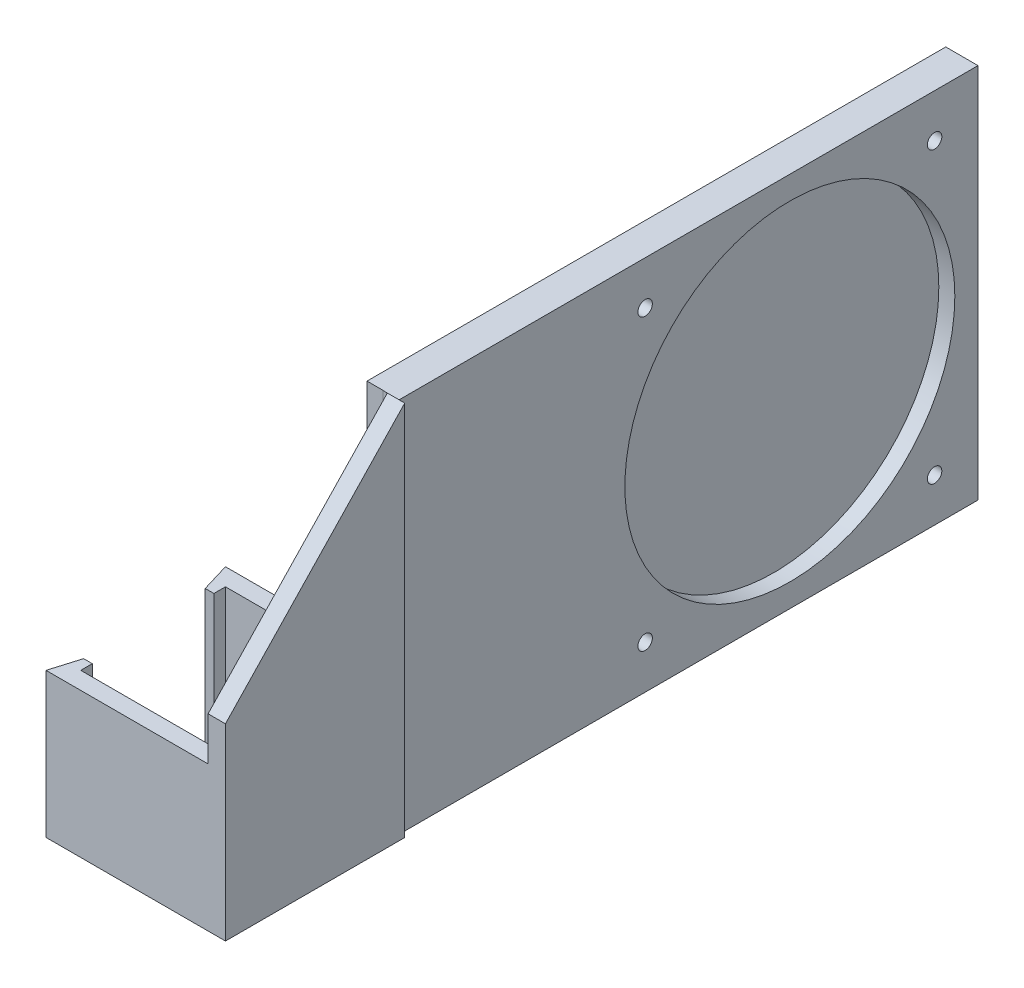
ISO-10303-21;
HEADER;
FILE_DESCRIPTION(('STEP AP214'),'2;1');
FILE_NAME('part.step','',(''),(''),'','','');
FILE_SCHEMA(('AUTOMOTIVE_DESIGN { 1 0 10303 214 1 1 1 1 }'));
ENDSEC;
DATA;
#1=APPLICATION_CONTEXT('core data for automotive mechanical design processes');
#2=APPLICATION_PROTOCOL_DEFINITION('international standard','automotive_design',2000,#1);
#3=PRODUCT_CONTEXT('',#1,'mechanical');
#4=PRODUCT('Part','Part','',(#3));
#5=PRODUCT_RELATED_PRODUCT_CATEGORY('part','',(#4));
#6=PRODUCT_DEFINITION_FORMATION('','',#4);
#7=PRODUCT_DEFINITION_CONTEXT('part definition',#1,'design');
#8=PRODUCT_DEFINITION('design','',#6,#7);
#9=PRODUCT_DEFINITION_SHAPE('','',#8);
#10=(LENGTH_UNIT() NAMED_UNIT(*) SI_UNIT(.MILLI.,.METRE.));
#11=(NAMED_UNIT(*) PLANE_ANGLE_UNIT() SI_UNIT($,.RADIAN.));
#12=(NAMED_UNIT(*) SI_UNIT($,.STERADIAN.) SOLID_ANGLE_UNIT());
#13=UNCERTAINTY_MEASURE_WITH_UNIT(LENGTH_MEASURE(1.E-05),#10,'distance_accuracy_value','');
#14=(GEOMETRIC_REPRESENTATION_CONTEXT(3) GLOBAL_UNCERTAINTY_ASSIGNED_CONTEXT((#13)) GLOBAL_UNIT_ASSIGNED_CONTEXT((#10,
#11,#12)) REPRESENTATION_CONTEXT('',''));
#15=CARTESIAN_POINT('',(0.,0.,0.));
#16=DIRECTION('',(0.,0.,1.));
#17=DIRECTION('',(1.,0.,0.));
#18=AXIS2_PLACEMENT_3D('',#15,#16,#17);
#19=CARTESIAN_POINT('',(0.,25.,0.));
#20=DIRECTION('',(0.,1.,0.));
#21=DIRECTION('',(0.,0.,1.));
#22=AXIS2_PLACEMENT_3D('',#19,#20,#21);
#23=PLANE('',#22);
#24=DIRECTION('',(1.,0.,0.));
#25=VECTOR('',#24,1.);
#26=CARTESIAN_POINT('',(-66.8257575757576,25.,-3.96973979401218));
#27=LINE('',#26,#25);
#28=CARTESIAN_POINT('',(-66.8257575757576,25.,-3.96973979401218));
#29=VERTEX_POINT('',#28);
#30=CARTESIAN_POINT('',(-38.8257575757576,25.,-3.96973979401218));
#31=VERTEX_POINT('',#30);
#32=EDGE_CURVE('E404',#29,#31,#27,.T.);
#33=ORIENTED_EDGE('',*,*,#32,.T.);
#34=DIRECTION('',(0.,0.,1.));
#35=VECTOR('',#34,1.);
#36=CARTESIAN_POINT('',(-38.8257575757576,25.,-34.9382664031757));
#37=LINE('',#36,#35);
#38=CARTESIAN_POINT('',(-38.8257575757576,25.,-6.96973979401218));
#39=VERTEX_POINT('',#38);
#40=EDGE_CURVE('E328',#39,#31,#37,.T.);
#41=ORIENTED_EDGE('',*,*,#40,.F.);
#42=DIRECTION('',(-1.,0.,0.));
#43=VECTOR('',#42,1.);
#44=CARTESIAN_POINT('',(-38.8257575757576,25.,-6.96973979401218));
#45=LINE('',#44,#43);
#46=CARTESIAN_POINT('',(-63.8257575757576,25.,-6.96973979401218));
#47=VERTEX_POINT('',#46);
#48=EDGE_CURVE('E398',#39,#47,#45,.T.);
#49=ORIENTED_EDGE('',*,*,#48,.T.);
#50=DIRECTION('',(0.,0.,-1.));
#51=VECTOR('',#50,1.);
#52=CARTESIAN_POINT('',(-63.8257575757576,25.,-6.96973979401218));
#53=LINE('',#52,#51);
#54=CARTESIAN_POINT('',(-63.8257575757576,25.,-8.96973979401218));
#55=VERTEX_POINT('',#54);
#56=EDGE_CURVE('E400',#47,#55,#53,.T.);
#57=ORIENTED_EDGE('',*,*,#56,.T.);
#58=DIRECTION('',(-1.,0.,0.));
#59=VECTOR('',#58,1.);
#60=CARTESIAN_POINT('',(-63.8257575757576,25.,-8.96973979401218));
#61=LINE('',#60,#59);
#62=CARTESIAN_POINT('',(-65.3257575757576,25.,-8.96973979401218));
#63=VERTEX_POINT('',#62);
#64=EDGE_CURVE('E402',#55,#63,#61,.T.);
#65=ORIENTED_EDGE('',*,*,#64,.T.);
#66=DIRECTION('',(-0.287347885566346,0.,0.957826285221151));
#67=VECTOR('',#66,1.);
#68=CARTESIAN_POINT('',(-66.8257575757576,25.,-3.96973979401218));
#69=LINE('',#68,#67);
#70=EDGE_CURVE('E238',#63,#29,#69,.T.);
#71=ORIENTED_EDGE('',*,*,#70,.T.);
#72=EDGE_LOOP('',(#33,#41,#49,#57,#65,#71));
#73=FACE_BOUND('',#72,.T.);
#74=ADVANCED_FACE('F33',(#73),#23,.T.);
#75=DIRECTION('',(1.,0.,0.));
#76=VECTOR('',#75,1.);
#77=CARTESIAN_POINT('',(-63.8257575757576,25.,-31.9697397940122));
#78=LINE('',#77,#76);
#79=CARTESIAN_POINT('',(-63.8257575757576,25.,-31.9697397940122));
#80=VERTEX_POINT('',#79);
#81=CARTESIAN_POINT('',(-38.8257575757576,25.,-31.9697397940122));
#82=VERTEX_POINT('',#81);
#83=EDGE_CURVE('E395',#80,#82,#78,.T.);
#84=ORIENTED_EDGE('',*,*,#83,.T.);
#85=CARTESIAN_POINT('',(-38.8257575757576,25.,-34.9382664031757));
#86=VERTEX_POINT('',#85);
#87=EDGE_CURVE('E329',#86,#82,#37,.T.);
#88=ORIENTED_EDGE('',*,*,#87,.F.);
#89=DIRECTION('',(1.,0.,0.));
#90=VECTOR('',#89,1.);
#91=CARTESIAN_POINT('',(0.,25.,-34.9382664031757));
#92=LINE('',#91,#90);
#93=CARTESIAN_POINT('',(-39.5643312219053,25.,-34.9382664031757));
#94=VERTEX_POINT('',#93);
#95=EDGE_CURVE('E55',#94,#86,#92,.T.);
#96=ORIENTED_EDGE('',*,*,#95,.F.);
#97=DIRECTION('',(0.,0.,-1.));
#98=VECTOR('',#97,1.);
#99=CARTESIAN_POINT('',(-39.5643312219053,25.,0.));
#100=LINE('',#99,#98);
#101=CARTESIAN_POINT('',(-39.5643312219053,25.,-34.9697397940122));
#102=VERTEX_POINT('',#101);
#103=EDGE_CURVE('E362',#94,#102,#100,.T.);
#104=ORIENTED_EDGE('',*,*,#103,.T.);
#105=DIRECTION('',(-1.,0.,0.));
#106=VECTOR('',#105,1.);
#107=CARTESIAN_POINT('',(-36.5790075050805,25.,-34.9697397940122));
#108=LINE('',#107,#106);
#109=CARTESIAN_POINT('',(-42.3725124463863,25.,-34.9697397940122));
#110=VERTEX_POINT('',#109);
#111=EDGE_CURVE('E391',#102,#110,#108,.T.);
#112=ORIENTED_EDGE('',*,*,#111,.T.);
#113=CARTESIAN_POINT('',(-66.8257575757576,25.,-34.9697397940122));
#114=VERTEX_POINT('',#113);
#115=EDGE_CURVE('E225',#110,#114,#108,.T.);
#116=ORIENTED_EDGE('',*,*,#115,.T.);
#117=DIRECTION('',(0.287347885566346,0.,0.957826285221151));
#118=VECTOR('',#117,1.);
#119=CARTESIAN_POINT('',(-66.8257575757576,25.,-34.9697397940122));
#120=LINE('',#119,#118);
#121=CARTESIAN_POINT('',(-65.3257575757576,25.,-29.9697397940122));
#122=VERTEX_POINT('',#121);
#123=EDGE_CURVE('E381',#114,#122,#120,.T.);
#124=ORIENTED_EDGE('',*,*,#123,.T.);
#125=DIRECTION('',(1.,0.,0.));
#126=VECTOR('',#125,1.);
#127=CARTESIAN_POINT('',(-66.8257575757576,25.,-29.9697397940122));
#128=LINE('',#127,#126);
#129=CARTESIAN_POINT('',(-63.8257575757576,25.,-29.9697397940122));
#130=VERTEX_POINT('',#129);
#131=EDGE_CURVE('E390',#122,#130,#128,.T.);
#132=ORIENTED_EDGE('',*,*,#131,.T.);
#133=DIRECTION('',(0.,0.,-1.));
#134=VECTOR('',#133,1.);
#135=CARTESIAN_POINT('',(-63.8257575757576,25.,-29.9697397940122));
#136=LINE('',#135,#134);
#137=EDGE_CURVE('E393',#130,#80,#136,.T.);
#138=ORIENTED_EDGE('',*,*,#137,.T.);
#139=EDGE_LOOP('',(#84,#88,#96,#104,#112,#116,#124,#132,#138));
#140=FACE_BOUND('',#139,.T.);
#141=ADVANCED_FACE('F488',(#140),#23,.T.);
#142=DIRECTION('',(0.,0.,1.));
#143=VECTOR('',#142,1.);
#144=CARTESIAN_POINT('',(-36.7989439252784,25.,0.));
#145=LINE('',#144,#143);
#146=CARTESIAN_POINT('',(-36.7989439252784,25.,-34.9697397940122));
#147=VERTEX_POINT('',#146);
#148=CARTESIAN_POINT('',(-36.7989439252784,25.,-34.9382664031757));
#149=VERTEX_POINT('',#148);
#150=EDGE_CURVE('E364',#147,#149,#145,.T.);
#151=ORIENTED_EDGE('',*,*,#150,.T.);
#152=DIRECTION('',(-1.,0.,0.));
#153=VECTOR('',#152,1.);
#154=CARTESIAN_POINT('',(-33.7989439252784,25.,-34.9382664031757));
#155=LINE('',#154,#153);
#156=CARTESIAN_POINT('',(-36.5643312219053,25.,-34.9382664031757));
#157=VERTEX_POINT('',#156);
#158=EDGE_CURVE('E321',#157,#149,#155,.T.);
#159=ORIENTED_EDGE('',*,*,#158,.F.);
#160=DIRECTION('',(-0.422618261740694,0.,-0.906307787036653));
#161=VECTOR('',#160,1.);
#162=CARTESIAN_POINT('',(-22.1234701022757,25.,-3.96973979401218));
#163=LINE('',#162,#161);
#164=CARTESIAN_POINT('',(-36.5790075050805,25.,-34.9697397940122));
#165=VERTEX_POINT('',#164);
#166=EDGE_CURVE('E242',#157,#165,#163,.T.);
#167=ORIENTED_EDGE('',*,*,#166,.T.);
#168=EDGE_CURVE('E387',#165,#147,#108,.T.);
#169=ORIENTED_EDGE('',*,*,#168,.T.);
#170=EDGE_LOOP('',(#151,#159,#167,#169));
#171=FACE_BOUND('',#170,.T.);
#172=ADVANCED_FACE('F411',(#171),#23,.T.);
#173=CARTESIAN_POINT('',(0.,0.,-34.9382664031757));
#174=DIRECTION('',(0.,0.,1.));
#175=DIRECTION('',(1.,0.,0.));
#176=AXIS2_PLACEMENT_3D('',#173,#174,#175);
#177=PLANE('',#176);
#178=ORIENTED_EDGE('',*,*,#95,.T.);
#179=DIRECTION('',(0.,-1.,0.));
#180=VECTOR('',#179,1.);
#181=CARTESIAN_POINT('',(-38.8257575757576,96.3738505099248,-34.9382664031757));
#182=LINE('',#181,#180);
#183=CARTESIAN_POINT('',(-38.8257575757576,65.,-34.9382664031757));
#184=VERTEX_POINT('',#183);
#185=EDGE_CURVE('E326',#184,#86,#182,.T.);
#186=ORIENTED_EDGE('',*,*,#185,.F.);
#187=DIRECTION('',(1.,0.,0.));
#188=VECTOR('',#187,1.);
#189=CARTESIAN_POINT('',(-36.7989439252784,65.,-34.9382664031757));
#190=LINE('',#189,#188);
#191=CARTESIAN_POINT('',(-39.5643312219053,65.,-34.9382664031757));
#192=VERTEX_POINT('',#191);
#193=EDGE_CURVE('E338',#192,#184,#190,.T.);
#194=ORIENTED_EDGE('',*,*,#193,.F.);
#195=DIRECTION('',(0.,1.,0.));
#196=VECTOR('',#195,1.);
#197=CARTESIAN_POINT('',(-39.5643312219053,0.,-34.9382664031757));
#198=LINE('',#197,#196);
#199=EDGE_CURVE('E349',#94,#192,#198,.T.);
#200=ORIENTED_EDGE('',*,*,#199,.F.);
#201=EDGE_LOOP('',(#178,#186,#194,#200));
#202=FACE_BOUND('',#201,.T.);
#203=ADVANCED_FACE('F560',(#202),#177,.T.);
#204=CARTESIAN_POINT('',(-36.5790075050805,25.,-34.9697397940122));
#205=DIRECTION('',(0.,0.,1.));
#206=DIRECTION('',(1.,0.,0.));
#207=AXIS2_PLACEMENT_3D('',#204,#205,#206);
#208=PLANE('',#207);
#209=DIRECTION('',(0.,-1.,0.));
#210=VECTOR('',#209,1.);
#211=CARTESIAN_POINT('',(-36.7989439252784,25.,-34.9697397940122));
#212=LINE('',#211,#210);
#213=CARTESIAN_POINT('',(-36.7989439252784,0.,-34.9697397940122));
#214=VERTEX_POINT('',#213);
#215=EDGE_CURVE('E367',#147,#214,#212,.T.);
#216=ORIENTED_EDGE('',*,*,#215,.F.);
#217=ORIENTED_EDGE('',*,*,#168,.F.);
#218=DIRECTION('',(0.,-1.,0.));
#219=VECTOR('',#218,1.);
#220=CARTESIAN_POINT('',(-36.5790075050805,25.,-34.9697397940122));
#221=LINE('',#220,#219);
#222=CARTESIAN_POINT('',(-36.5790075050805,0.,-34.9697397940122));
#223=VERTEX_POINT('',#222);
#224=EDGE_CURVE('E263',#165,#223,#221,.T.);
#225=ORIENTED_EDGE('',*,*,#224,.T.);
#226=DIRECTION('',(-1.,0.,0.));
#227=VECTOR('',#226,1.);
#228=CARTESIAN_POINT('',(-36.5790075050805,0.,-34.9697397940122));
#229=LINE('',#228,#227);
#230=EDGE_CURVE('E234',#223,#214,#229,.T.);
#231=ORIENTED_EDGE('',*,*,#230,.T.);
#232=EDGE_LOOP('',(#216,#217,#225,#231));
#233=FACE_BOUND('',#232,.T.);
#234=ADVANCED_FACE('F35',(#233),#208,.F.);
#235=ORIENTED_EDGE('',*,*,#115,.F.);
#236=DIRECTION('',(0.,-1.,0.));
#237=VECTOR('',#236,1.);
#238=CARTESIAN_POINT('',(-42.3725124463863,165.013988838993,-34.9697397940122));
#239=LINE('',#238,#237);
#240=CARTESIAN_POINT('',(-42.3725124463863,0.,-34.9697397940122));
#241=VERTEX_POINT('',#240);
#242=EDGE_CURVE('E208',#110,#241,#239,.T.);
#243=ORIENTED_EDGE('',*,*,#242,.T.);
#244=CARTESIAN_POINT('',(-66.8257575757576,0.,-34.9697397940122));
#245=VERTEX_POINT('',#244);
#246=EDGE_CURVE('E223',#241,#245,#229,.T.);
#247=ORIENTED_EDGE('',*,*,#246,.T.);
#248=DIRECTION('',(0.,-1.,0.));
#249=VECTOR('',#248,1.);
#250=CARTESIAN_POINT('',(-66.8257575757576,25.,-34.9697397940122));
#251=LINE('',#250,#249);
#252=EDGE_CURVE('E287',#114,#245,#251,.T.);
#253=ORIENTED_EDGE('',*,*,#252,.F.);
#254=EDGE_LOOP('',(#235,#243,#247,#253));
#255=FACE_BOUND('',#254,.T.);
#256=ADVANCED_FACE('F221',(#255),#208,.F.);
#257=CARTESIAN_POINT('',(-66.8257575757576,25.,-29.9697397940122));
#258=DIRECTION('',(0.,0.,-1.));
#259=DIRECTION('',(-1.,0.,0.));
#260=AXIS2_PLACEMENT_3D('',#257,#258,#259);
#261=PLANE('',#260);
#262=ORIENTED_EDGE('',*,*,#131,.F.);
#263=DIRECTION('',(0.,-1.,0.));
#264=VECTOR('',#263,1.);
#265=CARTESIAN_POINT('',(-65.3257575757576,25.,-29.9697397940122));
#266=LINE('',#265,#264);
#267=CARTESIAN_POINT('',(-65.3257575757576,0.,-29.9697397940122));
#268=VERTEX_POINT('',#267);
#269=EDGE_CURVE('E379',#122,#268,#266,.T.);
#270=ORIENTED_EDGE('',*,*,#269,.T.);
#271=DIRECTION('',(1.,0.,0.));
#272=VECTOR('',#271,1.);
#273=CARTESIAN_POINT('',(-66.8257575757576,0.,-29.9697397940122));
#274=LINE('',#273,#272);
#275=CARTESIAN_POINT('',(-63.8257575757576,0.,-29.9697397940122));
#276=VERTEX_POINT('',#275);
#277=EDGE_CURVE('E237',#268,#276,#274,.T.);
#278=ORIENTED_EDGE('',*,*,#277,.T.);
#279=DIRECTION('',(0.,-1.,0.));
#280=VECTOR('',#279,1.);
#281=CARTESIAN_POINT('',(-63.8257575757576,25.,-29.9697397940122));
#282=LINE('',#281,#280);
#283=EDGE_CURVE('E284',#130,#276,#282,.T.);
#284=ORIENTED_EDGE('',*,*,#283,.F.);
#285=EDGE_LOOP('',(#262,#270,#278,#284));
#286=FACE_BOUND('',#285,.T.);
#287=ADVANCED_FACE('F484',(#286),#261,.F.);
#288=CARTESIAN_POINT('',(-63.8257575757576,25.,-29.9697397940122));
#289=DIRECTION('',(-1.,0.,0.));
#290=DIRECTION('',(0.,0.,1.));
#291=AXIS2_PLACEMENT_3D('',#288,#289,#290);
#292=PLANE('',#291);
#293=DIRECTION('',(0.,0.,-1.));
#294=VECTOR('',#293,1.);
#295=CARTESIAN_POINT('',(-63.8257575757576,0.,-29.9697397940122));
#296=LINE('',#295,#294);
#297=CARTESIAN_POINT('',(-63.8257575757576,0.,-31.9697397940122));
#298=VERTEX_POINT('',#297);
#299=EDGE_CURVE('E245',#276,#298,#296,.T.);
#300=ORIENTED_EDGE('',*,*,#299,.T.);
#301=DIRECTION('',(0.,-1.,0.));
#302=VECTOR('',#301,1.);
#303=CARTESIAN_POINT('',(-63.8257575757576,25.,-31.9697397940122));
#304=LINE('',#303,#302);
#305=EDGE_CURVE('E281',#80,#298,#304,.T.);
#306=ORIENTED_EDGE('',*,*,#305,.F.);
#307=ORIENTED_EDGE('',*,*,#137,.F.);
#308=ORIENTED_EDGE('',*,*,#283,.T.);
#309=EDGE_LOOP('',(#300,#306,#307,#308));
#310=FACE_BOUND('',#309,.T.);
#311=ADVANCED_FACE('F480',(#310),#292,.F.);
#312=CARTESIAN_POINT('',(-63.8257575757576,25.,-31.9697397940122));
#313=DIRECTION('',(0.,0.,-1.));
#314=DIRECTION('',(-1.,0.,0.));
#315=AXIS2_PLACEMENT_3D('',#312,#313,#314);
#316=PLANE('',#315);
#317=DIRECTION('',(1.,0.,0.));
#318=VECTOR('',#317,1.);
#319=CARTESIAN_POINT('',(-63.8257575757576,0.,-31.9697397940122));
#320=LINE('',#319,#318);
#321=CARTESIAN_POINT('',(-38.8257575757576,0.,-31.9697397940122));
#322=VERTEX_POINT('',#321);
#323=EDGE_CURVE('E247',#298,#322,#320,.T.);
#324=ORIENTED_EDGE('',*,*,#323,.T.);
#325=DIRECTION('',(0.,-1.,0.));
#326=VECTOR('',#325,1.);
#327=CARTESIAN_POINT('',(-38.8257575757576,25.,-31.9697397940122));
#328=LINE('',#327,#326);
#329=EDGE_CURVE('E278',#82,#322,#328,.T.);
#330=ORIENTED_EDGE('',*,*,#329,.F.);
#331=ORIENTED_EDGE('',*,*,#83,.F.);
#332=ORIENTED_EDGE('',*,*,#305,.T.);
#333=EDGE_LOOP('',(#324,#330,#331,#332));
#334=FACE_BOUND('',#333,.T.);
#335=ADVANCED_FACE('F475',(#334),#316,.F.);
#336=CARTESIAN_POINT('',(-38.8257575757576,25.,-31.9697397940122));
#337=DIRECTION('',(1.,0.,0.));
#338=DIRECTION('',(0.,0.,-1.));
#339=AXIS2_PLACEMENT_3D('',#336,#337,#338);
#340=PLANE('',#339);
#341=DIRECTION('',(0.,-1.,0.));
#342=VECTOR('',#341,1.);
#343=CARTESIAN_POINT('',(-38.8257575757576,96.3738505099248,-3.96973979401218));
#344=LINE('',#343,#342);
#345=CARTESIAN_POINT('',(-38.8257575757576,32.5,-3.96973979401218));
#346=VERTEX_POINT('',#345);
#347=EDGE_CURVE('E331',#346,#31,#344,.T.);
#348=ORIENTED_EDGE('',*,*,#347,.F.);
#349=DIRECTION('',(0.,0.72395829288421,-0.689843743295669));
#350=VECTOR('',#349,1.);
#351=CARTESIAN_POINT('',(-38.8257575757576,42.5528396913205,-13.5488669779603));
#352=LINE('',#351,#350);
#353=EDGE_CURVE('E318',#346,#184,#352,.T.);
#354=ORIENTED_EDGE('',*,*,#353,.T.);
#355=ORIENTED_EDGE('',*,*,#185,.T.);
#356=ORIENTED_EDGE('',*,*,#87,.T.);
#357=ORIENTED_EDGE('',*,*,#329,.T.);
#358=DIRECTION('',(0.,0.,1.));
#359=VECTOR('',#358,1.);
#360=CARTESIAN_POINT('',(-38.8257575757576,0.,-31.9697397940122));
#361=LINE('',#360,#359);
#362=CARTESIAN_POINT('',(-38.8257575757576,0.,-6.96973979401218));
#363=VERTEX_POINT('',#362);
#364=EDGE_CURVE('E249',#322,#363,#361,.T.);
#365=ORIENTED_EDGE('',*,*,#364,.T.);
#366=DIRECTION('',(0.,-1.,0.));
#367=VECTOR('',#366,1.);
#368=CARTESIAN_POINT('',(-38.8257575757576,25.,-6.96973979401218));
#369=LINE('',#368,#367);
#370=EDGE_CURVE('E275',#39,#363,#369,.T.);
#371=ORIENTED_EDGE('',*,*,#370,.F.);
#372=ORIENTED_EDGE('',*,*,#40,.T.);
#373=EDGE_LOOP('',(#348,#354,#355,#356,#357,#365,#371,#372));
#374=FACE_BOUND('',#373,.T.);
#375=ADVANCED_FACE('F470',(#374),#340,.F.);
#376=CARTESIAN_POINT('',(-38.8257575757576,25.,-6.96973979401218));
#377=DIRECTION('',(0.,0.,1.));
#378=DIRECTION('',(1.,0.,0.));
#379=AXIS2_PLACEMENT_3D('',#376,#377,#378);
#380=PLANE('',#379);
#381=DIRECTION('',(-1.,0.,0.));
#382=VECTOR('',#381,1.);
#383=CARTESIAN_POINT('',(-38.8257575757576,0.,-6.96973979401218));
#384=LINE('',#383,#382);
#385=CARTESIAN_POINT('',(-63.8257575757576,0.,-6.96973979401218));
#386=VERTEX_POINT('',#385);
#387=EDGE_CURVE('E251',#363,#386,#384,.T.);
#388=ORIENTED_EDGE('',*,*,#387,.T.);
#389=DIRECTION('',(0.,-1.,0.));
#390=VECTOR('',#389,1.);
#391=CARTESIAN_POINT('',(-63.8257575757576,25.,-6.96973979401218));
#392=LINE('',#391,#390);
#393=EDGE_CURVE('E272',#47,#386,#392,.T.);
#394=ORIENTED_EDGE('',*,*,#393,.F.);
#395=ORIENTED_EDGE('',*,*,#48,.F.);
#396=ORIENTED_EDGE('',*,*,#370,.T.);
#397=EDGE_LOOP('',(#388,#394,#395,#396));
#398=FACE_BOUND('',#397,.T.);
#399=ADVANCED_FACE('F465',(#398),#380,.F.);
#400=CARTESIAN_POINT('',(-63.8257575757576,25.,-6.96973979401218));
#401=DIRECTION('',(-1.,0.,0.));
#402=DIRECTION('',(0.,0.,1.));
#403=AXIS2_PLACEMENT_3D('',#400,#401,#402);
#404=PLANE('',#403);
#405=DIRECTION('',(0.,0.,-1.));
#406=VECTOR('',#405,1.);
#407=CARTESIAN_POINT('',(-63.8257575757576,0.,-6.96973979401218));
#408=LINE('',#407,#406);
#409=CARTESIAN_POINT('',(-63.8257575757576,0.,-8.96973979401218));
#410=VERTEX_POINT('',#409);
#411=EDGE_CURVE('E253',#386,#410,#408,.T.);
#412=ORIENTED_EDGE('',*,*,#411,.T.);
#413=DIRECTION('',(0.,-1.,0.));
#414=VECTOR('',#413,1.);
#415=CARTESIAN_POINT('',(-63.8257575757576,25.,-8.96973979401218));
#416=LINE('',#415,#414);
#417=EDGE_CURVE('E269',#55,#410,#416,.T.);
#418=ORIENTED_EDGE('',*,*,#417,.F.);
#419=ORIENTED_EDGE('',*,*,#56,.F.);
#420=ORIENTED_EDGE('',*,*,#393,.T.);
#421=EDGE_LOOP('',(#412,#418,#419,#420));
#422=FACE_BOUND('',#421,.T.);
#423=ADVANCED_FACE('F461',(#422),#404,.F.);
#424=CARTESIAN_POINT('',(-63.8257575757576,25.,-8.96973979401218));
#425=DIRECTION('',(0.,0.,1.));
#426=DIRECTION('',(1.,0.,0.));
#427=AXIS2_PLACEMENT_3D('',#424,#425,#426);
#428=PLANE('',#427);
#429=DIRECTION('',(-1.,0.,0.));
#430=VECTOR('',#429,1.);
#431=CARTESIAN_POINT('',(-63.8257575757576,0.,-8.96973979401218));
#432=LINE('',#431,#430);
#433=CARTESIAN_POINT('',(-65.3257575757576,0.,-8.96973979401218));
#434=VERTEX_POINT('',#433);
#435=EDGE_CURVE('E255',#410,#434,#432,.T.);
#436=ORIENTED_EDGE('',*,*,#435,.T.);
#437=DIRECTION('',(0.,-1.,0.));
#438=VECTOR('',#437,1.);
#439=CARTESIAN_POINT('',(-65.3257575757576,25.,-8.96973979401218));
#440=LINE('',#439,#438);
#441=EDGE_CURVE('E235',#63,#434,#440,.T.);
#442=ORIENTED_EDGE('',*,*,#441,.F.);
#443=ORIENTED_EDGE('',*,*,#64,.F.);
#444=ORIENTED_EDGE('',*,*,#417,.T.);
#445=EDGE_LOOP('',(#436,#442,#443,#444));
#446=FACE_BOUND('',#445,.T.);
#447=ADVANCED_FACE('F455',(#446),#428,.F.);
#448=CARTESIAN_POINT('',(-66.8257575757576,25.,-3.96973979401218));
#449=DIRECTION('',(0.,0.,-1.));
#450=DIRECTION('',(-1.,0.,0.));
#451=AXIS2_PLACEMENT_3D('',#448,#449,#450);
#452=PLANE('',#451);
#453=DIRECTION('',(1.,0.,0.));
#454=VECTOR('',#453,1.);
#455=CARTESIAN_POINT('',(-66.8257575757576,0.,-3.96973979401218));
#456=LINE('',#455,#454);
#457=CARTESIAN_POINT('',(-66.8257575757576,0.,-3.96973979401218));
#458=VERTEX_POINT('',#457);
#459=CARTESIAN_POINT('',(-35.8257575757576,0.,-3.96973979401218));
#460=VERTEX_POINT('',#459);
#461=EDGE_CURVE('E258',#458,#460,#456,.T.);
#462=ORIENTED_EDGE('',*,*,#461,.T.);
#463=DIRECTION('',(0.,-1.,0.));
#464=VECTOR('',#463,1.);
#465=CARTESIAN_POINT('',(-35.8257575757576,100.,-3.96973979401218));
#466=LINE('',#465,#464);
#467=CARTESIAN_POINT('',(-35.8257575757576,32.5,-3.96973979401218));
#468=VERTEX_POINT('',#467);
#469=EDGE_CURVE('E441',#468,#460,#466,.T.);
#470=ORIENTED_EDGE('',*,*,#469,.F.);
#471=DIRECTION('',(1.,0.,0.));
#472=VECTOR('',#471,1.);
#473=CARTESIAN_POINT('',(-133.798943925278,32.5,-3.96973979401218));
#474=LINE('',#473,#472);
#475=EDGE_CURVE('E294',#346,#468,#474,.T.);
#476=ORIENTED_EDGE('',*,*,#475,.F.);
#477=ORIENTED_EDGE('',*,*,#347,.T.);
#478=ORIENTED_EDGE('',*,*,#32,.F.);
#479=DIRECTION('',(0.,-1.,0.));
#480=VECTOR('',#479,1.);
#481=CARTESIAN_POINT('',(-66.8257575757576,25.,-3.96973979401218));
#482=LINE('',#481,#480);
#483=EDGE_CURVE('E266',#29,#458,#482,.T.);
#484=ORIENTED_EDGE('',*,*,#483,.T.);
#485=EDGE_LOOP('',(#462,#470,#476,#477,#478,#484));
#486=FACE_BOUND('',#485,.T.);
#487=ADVANCED_FACE('F446',(#486),#452,.F.);
#488=CARTESIAN_POINT('',(-22.1234701022757,25.,-3.96973979401218));
#489=DIRECTION('',(-0.906307787036653,0.,0.422618261740694));
#490=DIRECTION('',(0.422618261740694,0.,0.906307787036653));
#491=AXIS2_PLACEMENT_3D('',#488,#489,#490);
#492=PLANE('',#491);
#493=ORIENTED_EDGE('',*,*,#166,.F.);
#494=DIRECTION('',(0.,-1.,0.));
#495=VECTOR('',#494,1.);
#496=CARTESIAN_POINT('',(-36.5643312219053,25.,-34.9382664031757));
#497=LINE('',#496,#495);
#498=CARTESIAN_POINT('',(-36.5643312219053,0.,-34.9382664031757));
#499=VERTEX_POINT('',#498);
#500=EDGE_CURVE('E373',#157,#499,#497,.T.);
#501=ORIENTED_EDGE('',*,*,#500,.T.);
#502=DIRECTION('',(-0.422618261740694,0.,-0.906307787036653));
#503=VECTOR('',#502,1.);
#504=CARTESIAN_POINT('',(-22.1234701022757,0.,-3.96973979401218));
#505=LINE('',#504,#503);
#506=EDGE_CURVE('E261',#499,#223,#505,.T.);
#507=ORIENTED_EDGE('',*,*,#506,.T.);
#508=ORIENTED_EDGE('',*,*,#224,.F.);
#509=EDGE_LOOP('',(#493,#501,#507,#508));
#510=FACE_BOUND('',#509,.T.);
#511=ADVANCED_FACE('F416',(#510),#492,.F.);
#512=CARTESIAN_POINT('',(0.,0.,0.));
#513=DIRECTION('',(0.,1.,0.));
#514=DIRECTION('',(0.,0.,1.));
#515=AXIS2_PLACEMENT_3D('',#512,#513,#514);
#516=PLANE('',#515);
#517=ORIENTED_EDGE('',*,*,#246,.F.);
#518=DIRECTION('',(0.,0.,-1.));
#519=VECTOR('',#518,1.);
#520=CARTESIAN_POINT('',(-42.3725124463863,0.,-34.9697397940122));
#521=LINE('',#520,#519);
#522=CARTESIAN_POINT('',(-42.3725124463863,0.,-134.944296965808));
#523=VERTEX_POINT('',#522);
#524=EDGE_CURVE('E203',#241,#523,#521,.T.);
#525=ORIENTED_EDGE('',*,*,#524,.T.);
#526=DIRECTION('',(1.,0.,0.));
#527=VECTOR('',#526,1.);
#528=CARTESIAN_POINT('',(-39.5643312219053,0.,-134.944296965808));
#529=LINE('',#528,#527);
#530=CARTESIAN_POINT('',(-39.5643312219053,0.,-134.944296965808));
#531=VERTEX_POINT('',#530);
#532=EDGE_CURVE('E216',#523,#531,#529,.T.);
#533=ORIENTED_EDGE('',*,*,#532,.T.);
#534=DIRECTION('',(0.,0.,1.));
#535=VECTOR('',#534,1.);
#536=CARTESIAN_POINT('',(-39.5643312219053,0.,-34.9697397940122));
#537=LINE('',#536,#535);
#538=CARTESIAN_POINT('',(-39.5643312219053,0.,-134.938266403176));
#539=VERTEX_POINT('',#538);
#540=EDGE_CURVE('E217',#531,#539,#537,.T.);
#541=ORIENTED_EDGE('',*,*,#540,.T.);
#542=DIRECTION('',(-1.,0.,0.));
#543=VECTOR('',#542,1.);
#544=CARTESIAN_POINT('',(-36.7989439252784,0.,-134.938266403176));
#545=LINE('',#544,#543);
#546=CARTESIAN_POINT('',(-36.7989439252784,0.,-134.938266403176));
#547=VERTEX_POINT('',#546);
#548=EDGE_CURVE('E337',#547,#539,#545,.T.);
#549=ORIENTED_EDGE('',*,*,#548,.F.);
#550=DIRECTION('',(0.,0.,1.));
#551=VECTOR('',#550,1.);
#552=CARTESIAN_POINT('',(-36.7989439252784,0.,-134.938266403176));
#553=LINE('',#552,#551);
#554=EDGE_CURVE('E358',#547,#214,#553,.T.);
#555=ORIENTED_EDGE('',*,*,#554,.T.);
#556=ORIENTED_EDGE('',*,*,#230,.F.);
#557=ORIENTED_EDGE('',*,*,#506,.F.);
#558=DIRECTION('',(1.,0.,0.));
#559=VECTOR('',#558,1.);
#560=CARTESIAN_POINT('',(-38.7989439252784,0.,-34.9382664031757));
#561=LINE('',#560,#559);
#562=CARTESIAN_POINT('',(-35.8257575757576,0.,-34.9382664031757));
#563=VERTEX_POINT('',#562);
#564=EDGE_CURVE('E370',#499,#563,#561,.T.);
#565=ORIENTED_EDGE('',*,*,#564,.T.);
#566=DIRECTION('',(0.,0.,-1.));
#567=VECTOR('',#566,1.);
#568=CARTESIAN_POINT('',(-35.8257575757576,0.,-3.96973979401218));
#569=LINE('',#568,#567);
#570=EDGE_CURVE('E439',#460,#563,#569,.T.);
#571=ORIENTED_EDGE('',*,*,#570,.F.);
#572=ORIENTED_EDGE('',*,*,#461,.F.);
#573=DIRECTION('',(-0.287347885566346,0.,0.957826285221151));
#574=VECTOR('',#573,1.);
#575=CARTESIAN_POINT('',(-66.8257575757576,0.,-3.96973979401218));
#576=LINE('',#575,#574);
#577=EDGE_CURVE('E378',#434,#458,#576,.T.);
#578=ORIENTED_EDGE('',*,*,#577,.F.);
#579=ORIENTED_EDGE('',*,*,#435,.F.);
#580=ORIENTED_EDGE('',*,*,#411,.F.);
#581=ORIENTED_EDGE('',*,*,#387,.F.);
#582=ORIENTED_EDGE('',*,*,#364,.F.);
#583=ORIENTED_EDGE('',*,*,#323,.F.);
#584=ORIENTED_EDGE('',*,*,#299,.F.);
#585=ORIENTED_EDGE('',*,*,#277,.F.);
#586=DIRECTION('',(0.287347885566346,0.,0.957826285221151));
#587=VECTOR('',#586,1.);
#588=CARTESIAN_POINT('',(-66.8257575757576,0.,-34.9697397940122));
#589=LINE('',#588,#587);
#590=EDGE_CURVE('E233',#245,#268,#589,.T.);
#591=ORIENTED_EDGE('',*,*,#590,.F.);
#592=EDGE_LOOP('',(#517,#525,#533,#541,#549,#555,#556,#557,#565,#571,#572,#578,#579,#580,#581,
#582,#583,#584,#585,#591));
#593=FACE_BOUND('',#592,.T.);
#594=ADVANCED_FACE('F231',(#593),#516,.F.);
#595=CARTESIAN_POINT('',(-66.8257575757576,25.,-34.9697397940122));
#596=DIRECTION('',(0.957826285221151,0.,-0.287347885566346));
#597=DIRECTION('',(-0.287347885566346,0.,-0.957826285221151));
#598=AXIS2_PLACEMENT_3D('',#595,#596,#597);
#599=PLANE('',#598);
#600=ORIENTED_EDGE('',*,*,#590,.T.);
#601=ORIENTED_EDGE('',*,*,#269,.F.);
#602=ORIENTED_EDGE('',*,*,#123,.F.);
#603=ORIENTED_EDGE('',*,*,#252,.T.);
#604=EDGE_LOOP('',(#600,#601,#602,#603));
#605=FACE_BOUND('',#604,.T.);
#606=ADVANCED_FACE('F487',(#605),#599,.F.);
#607=CARTESIAN_POINT('',(-66.8257575757576,25.,-3.96973979401218));
#608=DIRECTION('',(0.957826285221151,0.,0.287347885566346));
#609=DIRECTION('',(0.287347885566346,0.,-0.957826285221151));
#610=AXIS2_PLACEMENT_3D('',#607,#608,#609);
#611=PLANE('',#610);
#612=ORIENTED_EDGE('',*,*,#577,.T.);
#613=ORIENTED_EDGE('',*,*,#483,.F.);
#614=ORIENTED_EDGE('',*,*,#70,.F.);
#615=ORIENTED_EDGE('',*,*,#441,.T.);
#616=EDGE_LOOP('',(#612,#613,#614,#615));
#617=FACE_BOUND('',#616,.T.);
#618=ADVANCED_FACE('F449',(#617),#611,.F.);
#619=CARTESIAN_POINT('',(-38.7989439252784,56.3695655108971,-34.9382664031757));
#620=DIRECTION('',(0.,0.,-1.));
#621=DIRECTION('',(-1.,0.,0.));
#622=AXIS2_PLACEMENT_3D('',#619,#620,#621);
#623=PLANE('',#622);
#624=DIRECTION('',(0.,-1.,0.));
#625=VECTOR('',#624,1.);
#626=CARTESIAN_POINT('',(-35.8257575757576,100.,-34.9382664031757));
#627=LINE('',#626,#625);
#628=CARTESIAN_POINT('',(-35.8257575757576,65.,-34.9382664031757));
#629=VERTEX_POINT('',#628);
#630=EDGE_CURVE('E48',#629,#563,#627,.T.);
#631=ORIENTED_EDGE('',*,*,#630,.T.);
#632=ORIENTED_EDGE('',*,*,#564,.F.);
#633=ORIENTED_EDGE('',*,*,#500,.F.);
#634=ORIENTED_EDGE('',*,*,#158,.T.);
#635=DIRECTION('',(0.,-1.,0.));
#636=VECTOR('',#635,1.);
#637=CARTESIAN_POINT('',(-36.7989439252784,0.,-34.9382664031757));
#638=LINE('',#637,#636);
#639=CARTESIAN_POINT('',(-36.7989439252784,65.,-34.9382664031757));
#640=VERTEX_POINT('',#639);
#641=EDGE_CURVE('E325',#640,#149,#638,.T.);
#642=ORIENTED_EDGE('',*,*,#641,.F.);
#643=DIRECTION('',(1.,0.,0.));
#644=VECTOR('',#643,1.);
#645=CARTESIAN_POINT('',(-33.7989439252784,65.,-34.9382664031757));
#646=LINE('',#645,#644);
#647=EDGE_CURVE('E322',#640,#629,#646,.T.);
#648=ORIENTED_EDGE('',*,*,#647,.T.);
#649=EDGE_LOOP('',(#631,#632,#633,#634,#642,#648));
#650=FACE_BOUND('',#649,.T.);
#651=ADVANCED_FACE('F436',(#650),#623,.T.);
#652=CARTESIAN_POINT('',(-36.7989439252784,0.,-134.938266403176));
#653=DIRECTION('',(-1.,0.,0.));
#654=DIRECTION('',(0.,0.,1.));
#655=AXIS2_PLACEMENT_3D('',#652,#653,#654);
#656=PLANE('',#655);
#657=CARTESIAN_POINT('',(-36.7989439252784,7.49999999999999,-77.4382664031757));
#658=DIRECTION('',(1.,0.,0.));
#659=DIRECTION('',(0.,0.,-1.));
#660=AXIS2_PLACEMENT_3D('',#657,#658,#659);
#661=CIRCLE('',#660,1.25);
#662=CARTESIAN_POINT('',(-36.7989439252784,7.49999999999999,-78.6882664031757));
#663=VERTEX_POINT('',#662);
#664=EDGE_CURVE('E505',#663,#663,#661,.T.);
#665=ORIENTED_EDGE('',*,*,#664,.F.);
#666=EDGE_LOOP('',(#665));
#667=FACE_BOUND('',#666,.T.);
#668=CARTESIAN_POINT('',(-36.7989439252784,7.49999999999999,-127.438266403176));
#669=DIRECTION('',(1.,0.,0.));
#670=DIRECTION('',(0.,0.,-1.));
#671=AXIS2_PLACEMENT_3D('',#668,#669,#670);
#672=CIRCLE('',#671,1.25000000000001);
#673=CARTESIAN_POINT('',(-36.7989439252784,7.49999999999999,-128.688266403176));
#674=VERTEX_POINT('',#673);
#675=EDGE_CURVE('E510',#674,#674,#672,.T.);
#676=ORIENTED_EDGE('',*,*,#675,.F.);
#677=EDGE_LOOP('',(#676));
#678=FACE_BOUND('',#677,.T.);
#679=CARTESIAN_POINT('',(-36.7989439252784,57.5,-127.438266403176));
#680=DIRECTION('',(1.,0.,0.));
#681=DIRECTION('',(0.,0.,-1.));
#682=AXIS2_PLACEMENT_3D('',#679,#680,#681);
#683=CIRCLE('',#682,1.25000000000001);
#684=CARTESIAN_POINT('',(-36.7989439252784,57.5,-128.688266403176));
#685=VERTEX_POINT('',#684);
#686=EDGE_CURVE('E507',#685,#685,#683,.T.);
#687=ORIENTED_EDGE('',*,*,#686,.F.);
#688=EDGE_LOOP('',(#687));
#689=FACE_BOUND('',#688,.T.);
#690=CARTESIAN_POINT('',(-36.7989439252784,57.5,-77.4382664031757));
#691=DIRECTION('',(1.,0.,0.));
#692=DIRECTION('',(0.,0.,-1.));
#693=AXIS2_PLACEMENT_3D('',#690,#691,#692);
#694=CIRCLE('',#693,1.25);
#695=CARTESIAN_POINT('',(-36.7989439252784,57.5,-78.6882664031757));
#696=VERTEX_POINT('',#695);
#697=EDGE_CURVE('E300',#696,#696,#694,.T.);
#698=ORIENTED_EDGE('',*,*,#697,.F.);
#699=EDGE_LOOP('',(#698));
#700=FACE_BOUND('',#699,.T.);
#701=CARTESIAN_POINT('',(-36.7989439252784,32.5,-102.438266403176));
#702=DIRECTION('',(1.,0.,0.));
#703=DIRECTION('',(0.,0.,-1.));
#704=AXIS2_PLACEMENT_3D('',#701,#702,#703);
#705=CIRCLE('',#704,28.5);
#706=CARTESIAN_POINT('',(-36.7989439252784,32.5,-130.938266403176));
#707=VERTEX_POINT('',#706);
#708=EDGE_CURVE('E295',#707,#707,#705,.T.);
#709=ORIENTED_EDGE('',*,*,#708,.F.);
#710=EDGE_LOOP('',(#709));
#711=FACE_BOUND('',#710,.T.);
#712=ORIENTED_EDGE('',*,*,#150,.F.);
#713=ORIENTED_EDGE('',*,*,#215,.T.);
#714=ORIENTED_EDGE('',*,*,#554,.F.);
#715=DIRECTION('',(0.,-1.,0.));
#716=VECTOR('',#715,1.);
#717=CARTESIAN_POINT('',(-36.7989439252784,0.,-134.938266403176));
#718=LINE('',#717,#716);
#719=CARTESIAN_POINT('',(-36.7989439252784,65.,-134.938266403176));
#720=VERTEX_POINT('',#719);
#721=EDGE_CURVE('E334',#720,#547,#718,.T.);
#722=ORIENTED_EDGE('',*,*,#721,.F.);
#723=DIRECTION('',(0.,0.,1.));
#724=VECTOR('',#723,1.);
#725=CARTESIAN_POINT('',(-36.7989439252784,65.,-134.938266403176));
#726=LINE('',#725,#724);
#727=EDGE_CURVE('E346',#720,#640,#726,.T.);
#728=ORIENTED_EDGE('',*,*,#727,.T.);
#729=ORIENTED_EDGE('',*,*,#641,.T.);
#730=EDGE_LOOP('',(#712,#713,#714,#722,#728,#729));
#731=FACE_BOUND('',#730,.T.);
#732=ADVANCED_FACE('F422',(#667,#678,#689,#700,#711,#731),#656,.F.);
#733=CARTESIAN_POINT('',(-39.5643312219053,0.,-134.938266403176));
#734=DIRECTION('',(1.,0.,0.));
#735=DIRECTION('',(0.,0.,-1.));
#736=AXIS2_PLACEMENT_3D('',#733,#734,#735);
#737=PLANE('',#736);
#738=DIRECTION('',(0.,0.,1.));
#739=VECTOR('',#738,1.);
#740=CARTESIAN_POINT('',(-39.5643312219053,65.,-134.938266403176));
#741=LINE('',#740,#739);
#742=CARTESIAN_POINT('',(-39.5643312219053,65.,-34.9697397940122));
#743=VERTEX_POINT('',#742);
#744=EDGE_CURVE('E356',#743,#192,#741,.T.);
#745=ORIENTED_EDGE('',*,*,#744,.F.);
#746=DIRECTION('',(0.,-1.,0.));
#747=VECTOR('',#746,1.);
#748=CARTESIAN_POINT('',(-39.5643312219053,165.013988838993,-34.9697397940122));
#749=LINE('',#748,#747);
#750=EDGE_CURVE('E228',#743,#102,#749,.T.);
#751=ORIENTED_EDGE('',*,*,#750,.T.);
#752=ORIENTED_EDGE('',*,*,#103,.F.);
#753=ORIENTED_EDGE('',*,*,#199,.T.);
#754=EDGE_LOOP('',(#745,#751,#752,#753));
#755=FACE_BOUND('',#754,.T.);
#756=ADVANCED_FACE('F496',(#755),#737,.F.);
#757=CARTESIAN_POINT('',(-36.7989439252784,65.,-134.938266403176));
#758=DIRECTION('',(0.,-1.,0.));
#759=DIRECTION('',(0.,0.,-1.));
#760=AXIS2_PLACEMENT_3D('',#757,#758,#759);
#761=PLANE('',#760);
#762=ORIENTED_EDGE('',*,*,#193,.T.);
#763=DIRECTION('',(1.,0.,0.));
#764=VECTOR('',#763,1.);
#765=CARTESIAN_POINT('',(-36.7989439252784,65.,-34.9382664031757));
#766=LINE('',#765,#764);
#767=EDGE_CURVE('E41',#184,#640,#766,.T.);
#768=ORIENTED_EDGE('',*,*,#767,.T.);
#769=ORIENTED_EDGE('',*,*,#727,.F.);
#770=DIRECTION('',(1.,0.,0.));
#771=VECTOR('',#770,1.);
#772=CARTESIAN_POINT('',(-36.7989439252784,65.,-134.938266403176));
#773=LINE('',#772,#771);
#774=CARTESIAN_POINT('',(-39.5643312219053,65.,-134.938266403176));
#775=VERTEX_POINT('',#774);
#776=EDGE_CURVE('E344',#775,#720,#773,.T.);
#777=ORIENTED_EDGE('',*,*,#776,.F.);
#778=DIRECTION('',(0.,0.,-1.));
#779=VECTOR('',#778,1.);
#780=CARTESIAN_POINT('',(-39.5643312219053,65.,-34.9697397940122));
#781=LINE('',#780,#779);
#782=CARTESIAN_POINT('',(-39.5643312219053,65.,-134.944296965808));
#783=VERTEX_POINT('',#782);
#784=EDGE_CURVE('E502',#775,#783,#781,.T.);
#785=ORIENTED_EDGE('',*,*,#784,.T.);
#786=DIRECTION('',(-1.,0.,0.));
#787=VECTOR('',#786,1.);
#788=CARTESIAN_POINT('',(-39.5643312219053,65.,-134.944296965808));
#789=LINE('',#788,#787);
#790=CARTESIAN_POINT('',(-42.3725124463863,65.,-134.944296965808));
#791=VERTEX_POINT('',#790);
#792=EDGE_CURVE('E818',#783,#791,#789,.T.);
#793=ORIENTED_EDGE('',*,*,#792,.T.);
#794=DIRECTION('',(0.,0.,1.));
#795=VECTOR('',#794,1.);
#796=CARTESIAN_POINT('',(-42.3725124463863,65.,-34.9697397940122));
#797=LINE('',#796,#795);
#798=CARTESIAN_POINT('',(-42.3725124463863,65.,-34.9697397940122));
#799=VERTEX_POINT('',#798);
#800=EDGE_CURVE('E821',#791,#799,#797,.T.);
#801=ORIENTED_EDGE('',*,*,#800,.T.);
#802=DIRECTION('',(1.,0.,0.));
#803=VECTOR('',#802,1.);
#804=CARTESIAN_POINT('',(-39.5643312219053,65.,-34.9697397940122));
#805=LINE('',#804,#803);
#806=EDGE_CURVE('E442',#799,#743,#805,.T.);
#807=ORIENTED_EDGE('',*,*,#806,.T.);
#808=ORIENTED_EDGE('',*,*,#744,.T.);
#809=EDGE_LOOP('',(#762,#768,#769,#777,#785,#793,#801,#807,#808));
#810=FACE_BOUND('',#809,.T.);
#811=ADVANCED_FACE('F432',(#810),#761,.F.);
#812=CARTESIAN_POINT('',(0.,0.,-134.938266403176));
#813=DIRECTION('',(0.,0.,1.));
#814=DIRECTION('',(1.,0.,0.));
#815=AXIS2_PLACEMENT_3D('',#812,#813,#814);
#816=PLANE('',#815);
#817=ORIENTED_EDGE('',*,*,#721,.T.);
#818=ORIENTED_EDGE('',*,*,#548,.T.);
#819=DIRECTION('',(0.,1.,0.));
#820=VECTOR('',#819,1.);
#821=CARTESIAN_POINT('',(-39.5643312219053,0.,-134.938266403176));
#822=LINE('',#821,#820);
#823=EDGE_CURVE('E341',#539,#775,#822,.T.);
#824=ORIENTED_EDGE('',*,*,#823,.T.);
#825=ORIENTED_EDGE('',*,*,#776,.T.);
#826=EDGE_LOOP('',(#817,#818,#824,#825));
#827=FACE_BOUND('',#826,.T.);
#828=ADVANCED_FACE('F427',(#827),#816,.F.);
#829=CARTESIAN_POINT('',(-133.798943925278,65.,-34.9382664031757));
#830=DIRECTION('',(0.,-0.689843743295669,-0.72395829288421));
#831=DIRECTION('',(0.,0.72395829288421,-0.689843743295669));
#832=AXIS2_PLACEMENT_3D('',#829,#830,#831);
#833=PLANE('',#832);
#834=ORIENTED_EDGE('',*,*,#475,.T.);
#835=DIRECTION('',(0.,0.72395829288421,-0.689843743295669));
#836=VECTOR('',#835,1.);
#837=CARTESIAN_POINT('',(-35.8257575757576,65.,-34.9382664031757));
#838=LINE('',#837,#836);
#839=EDGE_CURVE('E11',#468,#629,#838,.T.);
#840=ORIENTED_EDGE('',*,*,#839,.T.);
#841=ORIENTED_EDGE('',*,*,#647,.F.);
#842=ORIENTED_EDGE('',*,*,#767,.F.);
#843=ORIENTED_EDGE('',*,*,#353,.F.);
#844=EDGE_LOOP('',(#834,#840,#841,#842,#843));
#845=FACE_BOUND('',#844,.T.);
#846=ADVANCED_FACE('F671',(#845),#833,.F.);
#847=CARTESIAN_POINT('',(-136.798943925278,32.5,-102.438266403176));
#848=DIRECTION('',(1.,0.,0.));
#849=DIRECTION('',(0.,0.,-1.));
#850=AXIS2_PLACEMENT_3D('',#847,#848,#849);
#851=CYLINDRICAL_SURFACE('',#850,28.5);
#852=ORIENTED_EDGE('',*,*,#708,.T.);
#853=EDGE_LOOP('',(#852));
#854=FACE_BOUND('',#853,.T.);
#855=CARTESIAN_POINT('',(-39.5643312219053,32.5,-102.438266403176));
#856=DIRECTION('',(1.,0.,0.));
#857=DIRECTION('',(0.,0.,-1.));
#858=AXIS2_PLACEMENT_3D('',#855,#856,#857);
#859=CIRCLE('',#858,28.5);
#860=CARTESIAN_POINT('',(-39.5643312219053,32.5,-130.938266403176));
#861=VERTEX_POINT('',#860);
#862=EDGE_CURVE('E291',#861,#861,#859,.T.);
#863=ORIENTED_EDGE('',*,*,#862,.F.);
#864=EDGE_LOOP('',(#863));
#865=FACE_BOUND('',#864,.T.);
#866=ADVANCED_FACE('F533',(#854,#865),#851,.F.);
#867=CARTESIAN_POINT('',(-136.798943925278,57.5,-77.4382664031757));
#868=DIRECTION('',(1.,0.,0.));
#869=DIRECTION('',(0.,0.,-1.));
#870=AXIS2_PLACEMENT_3D('',#867,#868,#869);
#871=CYLINDRICAL_SURFACE('',#870,1.25);
#872=ORIENTED_EDGE('',*,*,#697,.T.);
#873=EDGE_LOOP('',(#872));
#874=FACE_BOUND('',#873,.T.);
#875=CARTESIAN_POINT('',(-39.5643312219053,57.5,-77.4382664031757));
#876=DIRECTION('',(1.,0.,0.));
#877=DIRECTION('',(0.,0.,-1.));
#878=AXIS2_PLACEMENT_3D('',#875,#876,#877);
#879=CIRCLE('',#878,1.25);
#880=CARTESIAN_POINT('',(-39.5643312219053,57.5,-78.6882664031757));
#881=VERTEX_POINT('',#880);
#882=EDGE_CURVE('E296',#881,#881,#879,.T.);
#883=ORIENTED_EDGE('',*,*,#882,.F.);
#884=EDGE_LOOP('',(#883));
#885=FACE_BOUND('',#884,.T.);
#886=ADVANCED_FACE('F529',(#874,#885),#871,.F.);
#887=CARTESIAN_POINT('',(-136.798943925278,57.5,-127.438266403176));
#888=DIRECTION('',(1.,0.,0.));
#889=DIRECTION('',(0.,0.,-1.));
#890=AXIS2_PLACEMENT_3D('',#887,#888,#889);
#891=CYLINDRICAL_SURFACE('',#890,1.25000000000001);
#892=ORIENTED_EDGE('',*,*,#686,.T.);
#893=EDGE_LOOP('',(#892));
#894=FACE_BOUND('',#893,.T.);
#895=CARTESIAN_POINT('',(-39.5643312219053,57.5,-127.438266403176));
#896=DIRECTION('',(1.,0.,0.));
#897=DIRECTION('',(0.,0.,-1.));
#898=AXIS2_PLACEMENT_3D('',#895,#896,#897);
#899=CIRCLE('',#898,1.25000000000001);
#900=CARTESIAN_POINT('',(-39.5643312219053,57.5,-128.688266403176));
#901=VERTEX_POINT('',#900);
#902=EDGE_CURVE('E299',#901,#901,#899,.T.);
#903=ORIENTED_EDGE('',*,*,#902,.F.);
#904=EDGE_LOOP('',(#903));
#905=FACE_BOUND('',#904,.T.);
#906=ADVANCED_FACE('F532',(#894,#905),#891,.F.);
#907=CARTESIAN_POINT('',(-136.798943925278,7.49999999999999,-127.438266403176));
#908=DIRECTION('',(1.,0.,0.));
#909=DIRECTION('',(0.,0.,-1.));
#910=AXIS2_PLACEMENT_3D('',#907,#908,#909);
#911=CYLINDRICAL_SURFACE('',#910,1.25000000000001);
#912=ORIENTED_EDGE('',*,*,#675,.T.);
#913=EDGE_LOOP('',(#912));
#914=FACE_BOUND('',#913,.T.);
#915=CARTESIAN_POINT('',(-39.5643312219053,7.49999999999999,-127.438266403176));
#916=DIRECTION('',(1.,0.,0.));
#917=DIRECTION('',(0.,0.,-1.));
#918=AXIS2_PLACEMENT_3D('',#915,#916,#917);
#919=CIRCLE('',#918,1.25000000000001);
#920=CARTESIAN_POINT('',(-39.5643312219053,7.49999999999999,-128.688266403176));
#921=VERTEX_POINT('',#920);
#922=EDGE_CURVE('E303',#921,#921,#919,.T.);
#923=ORIENTED_EDGE('',*,*,#922,.F.);
#924=EDGE_LOOP('',(#923));
#925=FACE_BOUND('',#924,.T.);
#926=ADVANCED_FACE('F695',(#914,#925),#911,.F.);
#927=CARTESIAN_POINT('',(-136.798943925278,7.49999999999999,-77.4382664031757));
#928=DIRECTION('',(1.,0.,0.));
#929=DIRECTION('',(0.,0.,-1.));
#930=AXIS2_PLACEMENT_3D('',#927,#928,#929);
#931=CYLINDRICAL_SURFACE('',#930,1.25);
#932=ORIENTED_EDGE('',*,*,#664,.T.);
#933=EDGE_LOOP('',(#932));
#934=FACE_BOUND('',#933,.T.);
#935=CARTESIAN_POINT('',(-39.5643312219053,7.49999999999999,-77.4382664031757));
#936=DIRECTION('',(1.,0.,0.));
#937=DIRECTION('',(0.,0.,-1.));
#938=AXIS2_PLACEMENT_3D('',#935,#936,#937);
#939=CIRCLE('',#938,1.25);
#940=CARTESIAN_POINT('',(-39.5643312219053,7.49999999999999,-78.6882664031757));
#941=VERTEX_POINT('',#940);
#942=EDGE_CURVE('E305',#941,#941,#939,.T.);
#943=ORIENTED_EDGE('',*,*,#942,.F.);
#944=EDGE_LOOP('',(#943));
#945=FACE_BOUND('',#944,.T.);
#946=ADVANCED_FACE('F515',(#934,#945),#931,.F.);
#947=CARTESIAN_POINT('',(-35.8257575757576,100.,-3.96973979401218));
#948=DIRECTION('',(-1.,0.,0.));
#949=DIRECTION('',(0.,0.,1.));
#950=AXIS2_PLACEMENT_3D('',#947,#948,#949);
#951=PLANE('',#950);
#952=ORIENTED_EDGE('',*,*,#469,.T.);
#953=ORIENTED_EDGE('',*,*,#570,.T.);
#954=ORIENTED_EDGE('',*,*,#630,.F.);
#955=ORIENTED_EDGE('',*,*,#839,.F.);
#956=EDGE_LOOP('',(#952,#953,#954,#955));
#957=FACE_BOUND('',#956,.T.);
#958=ADVANCED_FACE('F714',(#957),#951,.F.);
#959=CARTESIAN_POINT('',(-39.5643312219053,165.013988838993,-34.9697397940122));
#960=DIRECTION('',(1.,0.,0.));
#961=DIRECTION('',(0.,0.,-1.));
#962=AXIS2_PLACEMENT_3D('',#959,#960,#961);
#963=PLANE('',#962);
#964=ORIENTED_EDGE('',*,*,#942,.T.);
#965=EDGE_LOOP('',(#964));
#966=FACE_BOUND('',#965,.T.);
#967=ADVANCED_FACE('F742',(#966),#963,.T.);
#968=ORIENTED_EDGE('',*,*,#922,.T.);
#969=EDGE_LOOP('',(#968));
#970=FACE_BOUND('',#969,.T.);
#971=ADVANCED_FACE('F548',(#970),#963,.T.);
#972=ORIENTED_EDGE('',*,*,#902,.T.);
#973=EDGE_LOOP('',(#972));
#974=FACE_BOUND('',#973,.T.);
#975=ADVANCED_FACE('F540',(#974),#963,.T.);
#976=ORIENTED_EDGE('',*,*,#882,.T.);
#977=EDGE_LOOP('',(#976));
#978=FACE_BOUND('',#977,.T.);
#979=ADVANCED_FACE('F537',(#978),#963,.T.);
#980=ORIENTED_EDGE('',*,*,#862,.T.);
#981=EDGE_LOOP('',(#980));
#982=FACE_BOUND('',#981,.T.);
#983=ADVANCED_FACE('F539',(#982),#963,.T.);
#984=ORIENTED_EDGE('',*,*,#823,.F.);
#985=ORIENTED_EDGE('',*,*,#540,.F.);
#986=DIRECTION('',(0.,-1.,0.));
#987=VECTOR('',#986,1.);
#988=CARTESIAN_POINT('',(-39.5643312219053,165.013988838993,-134.944296965808));
#989=LINE('',#988,#987);
#990=EDGE_CURVE('E820',#783,#531,#989,.T.);
#991=ORIENTED_EDGE('',*,*,#990,.F.);
#992=ORIENTED_EDGE('',*,*,#784,.F.);
#993=EDGE_LOOP('',(#984,#985,#991,#992));
#994=FACE_BOUND('',#993,.T.);
#995=ADVANCED_FACE('F546',(#994),#963,.T.);
#996=CARTESIAN_POINT('',(-39.5643312219053,165.013988838993,-134.944296965808));
#997=DIRECTION('',(0.,0.,-1.));
#998=DIRECTION('',(-1.,0.,0.));
#999=AXIS2_PLACEMENT_3D('',#996,#997,#998);
#1000=PLANE('',#999);
#1001=ORIENTED_EDGE('',*,*,#792,.F.);
#1002=ORIENTED_EDGE('',*,*,#990,.T.);
#1003=ORIENTED_EDGE('',*,*,#532,.F.);
#1004=DIRECTION('',(0.,-1.,0.));
#1005=VECTOR('',#1004,1.);
#1006=CARTESIAN_POINT('',(-42.3725124463863,165.013988838993,-134.944296965808));
#1007=LINE('',#1006,#1005);
#1008=EDGE_CURVE('E211',#791,#523,#1007,.T.);
#1009=ORIENTED_EDGE('',*,*,#1008,.F.);
#1010=EDGE_LOOP('',(#1001,#1002,#1003,#1009));
#1011=FACE_BOUND('',#1010,.T.);
#1012=ADVANCED_FACE('F789',(#1011),#1000,.T.);
#1013=CARTESIAN_POINT('',(-42.3725124463863,165.013988838993,-34.9697397940122));
#1014=DIRECTION('',(-1.,0.,0.));
#1015=DIRECTION('',(0.,0.,1.));
#1016=AXIS2_PLACEMENT_3D('',#1013,#1014,#1015);
#1017=PLANE('',#1016);
#1018=ORIENTED_EDGE('',*,*,#800,.F.);
#1019=ORIENTED_EDGE('',*,*,#1008,.T.);
#1020=ORIENTED_EDGE('',*,*,#524,.F.);
#1021=ORIENTED_EDGE('',*,*,#242,.F.);
#1022=EDGE_CURVE('E227',#799,#110,#239,.T.);
#1023=ORIENTED_EDGE('',*,*,#1022,.F.);
#1024=EDGE_LOOP('',(#1018,#1019,#1020,#1021,#1023));
#1025=FACE_BOUND('',#1024,.T.);
#1026=ADVANCED_FACE('F206',(#1025),#1017,.T.);
#1027=CARTESIAN_POINT('',(-39.5643312219053,165.013988838993,-34.9697397940122));
#1028=DIRECTION('',(0.,0.,1.));
#1029=DIRECTION('',(1.,0.,0.));
#1030=AXIS2_PLACEMENT_3D('',#1027,#1028,#1029);
#1031=PLANE('',#1030);
#1032=ORIENTED_EDGE('',*,*,#1022,.T.);
#1033=ORIENTED_EDGE('',*,*,#111,.F.);
#1034=ORIENTED_EDGE('',*,*,#750,.F.);
#1035=ORIENTED_EDGE('',*,*,#806,.F.);
#1036=EDGE_LOOP('',(#1032,#1033,#1034,#1035));
#1037=FACE_BOUND('',#1036,.T.);
#1038=ADVANCED_FACE('F492',(#1037),#1031,.T.);
#1039=CLOSED_SHELL('',(#74,#141,#172,#203,#234,#256,#287,#311,#335,#375,#399,#423,#447,#487,
#511,#594,#606,#618,#651,#732,#756,#811,#828,#846,#866,#886,#906,#926,#946,#958,#967,#971,#975,
#979,#983,#995,#1012,#1026,#1038));
#1040=MANIFOLD_SOLID_BREP('B2',#1039);
#1041=ADVANCED_BREP_SHAPE_REPRESENTATION('',(#18,#1040),#14);
#1042=SHAPE_DEFINITION_REPRESENTATION(#9,#1041);
ENDSEC;
END-ISO-10303-21;
